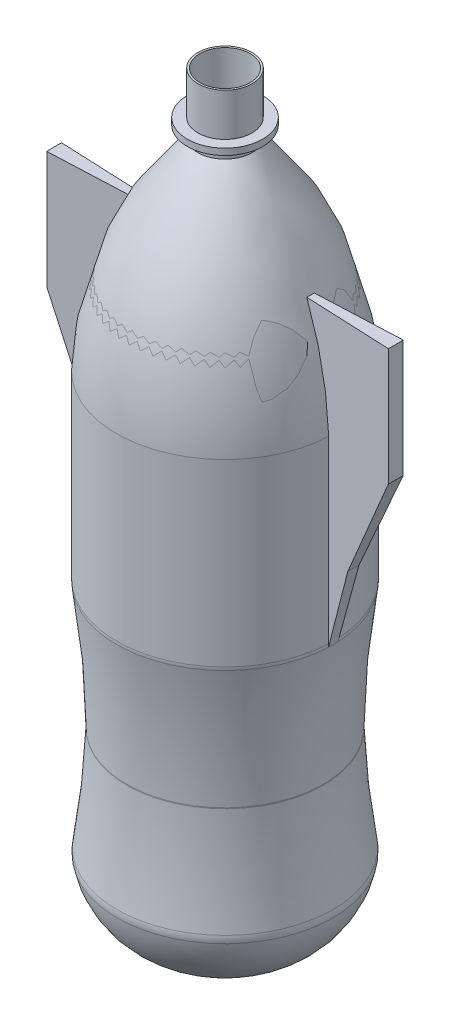
ISO-10303-21;
HEADER;
FILE_DESCRIPTION(('STEP AP214'),'2;1');
FILE_NAME('part.step','',(''),(''),'','','');
FILE_SCHEMA(('AUTOMOTIVE_DESIGN { 1 0 10303 214 1 1 1 1 }'));
ENDSEC;
DATA;
#1=APPLICATION_CONTEXT('core data for automotive mechanical design processes');
#2=APPLICATION_PROTOCOL_DEFINITION('international standard','automotive_design',2000,#1);
#3=PRODUCT_CONTEXT('',#1,'mechanical');
#4=PRODUCT('Part','Part','',(#3));
#5=PRODUCT_RELATED_PRODUCT_CATEGORY('part','',(#4));
#6=PRODUCT_DEFINITION_FORMATION('','',#4);
#7=PRODUCT_DEFINITION_CONTEXT('part definition',#1,'design');
#8=PRODUCT_DEFINITION('design','',#6,#7);
#9=PRODUCT_DEFINITION_SHAPE('','',#8);
#10=(LENGTH_UNIT() NAMED_UNIT(*) SI_UNIT(.MILLI.,.METRE.));
#11=(NAMED_UNIT(*) PLANE_ANGLE_UNIT() SI_UNIT($,.RADIAN.));
#12=(NAMED_UNIT(*) SI_UNIT($,.STERADIAN.) SOLID_ANGLE_UNIT());
#13=UNCERTAINTY_MEASURE_WITH_UNIT(LENGTH_MEASURE(1.E-05),#10,'distance_accuracy_value','');
#14=(GEOMETRIC_REPRESENTATION_CONTEXT(3) GLOBAL_UNCERTAINTY_ASSIGNED_CONTEXT((#13)) GLOBAL_UNIT_ASSIGNED_CONTEXT((#10,
#11,#12)) REPRESENTATION_CONTEXT('',''));
#15=CARTESIAN_POINT('',(0.,0.,0.));
#16=DIRECTION('',(0.,0.,1.));
#17=DIRECTION('',(1.,0.,0.));
#18=AXIS2_PLACEMENT_3D('',#15,#16,#17);
#19=CARTESIAN_POINT('',(0.,0.,0.));
#20=DIRECTION('',(0.,-1.,0.));
#21=DIRECTION('',(0.,0.,-1.));
#22=AXIS2_PLACEMENT_3D('',#19,#20,#21);
#23=CYLINDRICAL_SURFACE('',#22,50.9);
#24=CARTESIAN_POINT('',(0.,140.772436729844,0.));
#25=DIRECTION('',(0.,-1.,0.));
#26=DIRECTION('',(0.,0.,-1.));
#27=AXIS2_PLACEMENT_3D('',#24,#25,#26);
#28=CIRCLE('',#27,50.9);
#29=CARTESIAN_POINT('',(-50.8515544785166,140.772436729844,-2.22022681689561));
#30=VERTEX_POINT('',#29);
#31=CARTESIAN_POINT('',(50.8515544785166,140.772436729844,-2.22022681689561));
#32=VERTEX_POINT('',#31);
#33=EDGE_CURVE('E239',#30,#32,#28,.T.);
#34=ORIENTED_EDGE('',*,*,#33,.F.);
#35=DIRECTION('',(0.,-1.,0.));
#36=VECTOR('',#35,1.);
#37=CARTESIAN_POINT('',(-50.8515544785166,0.,-2.22022681689561));
#38=LINE('',#37,#36);
#39=CARTESIAN_POINT('',(-50.8515544785166,225.,-2.22022681689561));
#40=VERTEX_POINT('',#39);
#41=EDGE_CURVE('E234',#30,#40,#38,.F.);
#42=ORIENTED_EDGE('',*,*,#41,.T.);
#43=CARTESIAN_POINT('',(0.,225.,0.));
#44=DIRECTION('',(0.,-1.,0.));
#45=DIRECTION('',(0.,0.,-1.));
#46=AXIS2_PLACEMENT_3D('',#43,#44,#45);
#47=CIRCLE('',#46,50.9);
#48=CARTESIAN_POINT('',(50.8515544785166,225.,-2.22022681689561));
#49=VERTEX_POINT('',#48);
#50=EDGE_CURVE('E329',#40,#49,#47,.T.);
#51=ORIENTED_EDGE('',*,*,#50,.T.);
#52=DIRECTION('',(0.,-1.,0.));
#53=VECTOR('',#52,1.);
#54=CARTESIAN_POINT('',(50.8515544785166,0.,-2.22022681689561));
#55=LINE('',#54,#53);
#56=EDGE_CURVE('E231',#49,#32,#55,.T.);
#57=ORIENTED_EDGE('',*,*,#56,.T.);
#58=EDGE_LOOP('',(#34,#42,#51,#57));
#59=FACE_BOUND('',#58,.T.);
#60=ADVANCED_FACE('F41',(#59),#23,.T.);
#61=DIRECTION('',(0.,-1.,0.));
#62=VECTOR('',#61,1.);
#63=CARTESIAN_POINT('',(-50.8515544785166,0.,2.22022681689561));
#64=LINE('',#63,#62);
#65=CARTESIAN_POINT('',(-50.8515544785166,140.772436729844,2.22022681689561));
#66=VERTEX_POINT('',#65);
#67=CARTESIAN_POINT('',(-50.8515544785166,225.,2.22022681689561));
#68=VERTEX_POINT('',#67);
#69=EDGE_CURVE('E236',#66,#68,#64,.F.);
#70=ORIENTED_EDGE('',*,*,#69,.F.);
#71=CARTESIAN_POINT('',(50.8515544785166,140.772436729844,2.22022681689561));
#72=VERTEX_POINT('',#71);
#73=EDGE_CURVE('E242',#72,#66,#28,.T.);
#74=ORIENTED_EDGE('',*,*,#73,.F.);
#75=DIRECTION('',(0.,-1.,0.));
#76=VECTOR('',#75,1.);
#77=CARTESIAN_POINT('',(50.8515544785166,0.,2.22022681689561));
#78=LINE('',#77,#76);
#79=CARTESIAN_POINT('',(50.8515544785166,225.,2.22022681689561));
#80=VERTEX_POINT('',#79);
#81=EDGE_CURVE('E192',#80,#72,#78,.T.);
#82=ORIENTED_EDGE('',*,*,#81,.F.);
#83=EDGE_CURVE('E332',#80,#68,#47,.T.);
#84=ORIENTED_EDGE('',*,*,#83,.T.);
#85=EDGE_LOOP('',(#70,#74,#82,#84));
#86=FACE_BOUND('',#85,.T.);
#87=ADVANCED_FACE('F357',(#86),#23,.T.);
#88=CARTESIAN_POINT('',(0.,219.899303192665,0.));
#89=DIRECTION('',(0.,-1.,0.));
#90=DIRECTION('',(0.,0.,-1.));
#91=AXIS2_PLACEMENT_3D('',#88,#89,#90);
#92=DEGENERATE_TOROIDAL_SURFACE('',#91,99.0132512224308,150.,.F.);
#93=CARTESIAN_POINT('',(98.9190125468098,219.899303192664,-4.31889735937266));
#94=DIRECTION('',(0.0436193873653361,0.,0.999048221581858));
#95=DIRECTION('',(0.999048221581858,0.,-0.0436193873653361));
#96=AXIS2_PLACEMENT_3D('',#93,#94,#95);
#97=CIRCLE('',#96,150.000000000003);
#98=CARTESIAN_POINT('',(-40.1187717890936,275.8603906072,1.75162340464324));
#99=VERTEX_POINT('',#98);
#100=EDGE_CURVE('E175',#68,#99,#97,.F.);
#101=ORIENTED_EDGE('',*,*,#100,.F.);
#102=ORIENTED_EDGE('',*,*,#83,.F.);
#103=CARTESIAN_POINT('',(-98.9190125468098,219.899303192664,-4.31889735937266));
#104=DIRECTION('',(-0.0436193873653361,0.,0.999048221581858));
#105=DIRECTION('',(0.999048221581858,0.,0.0436193873653361));
#106=AXIS2_PLACEMENT_3D('',#103,#104,#105);
#107=CIRCLE('',#106,150.000000000003);
#108=CARTESIAN_POINT('',(40.1187717890936,275.8603906072,1.75162340464324));
#109=VERTEX_POINT('',#108);
#110=EDGE_CURVE('E193',#80,#109,#107,.T.);
#111=ORIENTED_EDGE('',*,*,#110,.T.);
#112=CARTESIAN_POINT('',(0.,275.8603906072,0.));
#113=DIRECTION('',(0.,-1.,0.));
#114=DIRECTION('',(0.,0.,-1.));
#115=AXIS2_PLACEMENT_3D('',#112,#113,#114);
#116=CIRCLE('',#115,40.1569923477477);
#117=CARTESIAN_POINT('',(40.1187717890936,275.8603906072,-1.75162340464324));
#118=VERTEX_POINT('',#117);
#119=EDGE_CURVE('E222',#118,#109,#116,.T.);
#120=ORIENTED_EDGE('',*,*,#119,.F.);
#121=CARTESIAN_POINT('',(-98.9190125468098,219.899303192664,4.31889735937266));
#122=DIRECTION('',(0.0436193873653361,0.,0.999048221581858));
#123=DIRECTION('',(0.999048221581858,0.,-0.0436193873653361));
#124=AXIS2_PLACEMENT_3D('',#121,#122,#123);
#125=CIRCLE('',#124,150.000000000003);
#126=EDGE_CURVE('E208',#49,#118,#125,.T.);
#127=ORIENTED_EDGE('',*,*,#126,.F.);
#128=ORIENTED_EDGE('',*,*,#50,.F.);
#129=CARTESIAN_POINT('',(98.9190125468098,219.899303192664,4.31889735937266));
#130=DIRECTION('',(-0.0436193873653361,0.,0.999048221581858));
#131=DIRECTION('',(0.999048221581858,0.,0.0436193873653361));
#132=AXIS2_PLACEMENT_3D('',#129,#130,#131);
#133=CIRCLE('',#132,150.000000000003);
#134=CARTESIAN_POINT('',(-40.1187717890936,275.8603906072,-1.75162340464324));
#135=VERTEX_POINT('',#134);
#136=EDGE_CURVE('E60',#40,#135,#133,.F.);
#137=ORIENTED_EDGE('',*,*,#136,.T.);
#138=CARTESIAN_POINT('',(0.,275.8603906072,0.));
#139=DIRECTION('',(0.,-1.,0.));
#140=DIRECTION('',(0.,0.,-1.));
#141=AXIS2_PLACEMENT_3D('',#138,#139,#140);
#142=CIRCLE('',#141,40.1569923477477);
#143=EDGE_CURVE('E55',#99,#135,#142,.T.);
#144=ORIENTED_EDGE('',*,*,#143,.F.);
#145=EDGE_LOOP('',(#101,#102,#111,#120,#127,#128,#137,#144));
#146=FACE_BOUND('',#145,.T.);
#147=CARTESIAN_POINT('',(0.,320.,0.));
#148=DIRECTION('',(0.,-1.,0.));
#149=DIRECTION('',(0.,0.,-1.));
#150=AXIS2_PLACEMENT_3D('',#147,#148,#149);
#151=CIRCLE('',#150,12.7);
#152=CARTESIAN_POINT('',(0.,320.,-12.7));
#153=VERTEX_POINT('',#152);
#154=EDGE_CURVE('E326',#153,#153,#151,.T.);
#155=ORIENTED_EDGE('',*,*,#154,.T.);
#156=EDGE_LOOP('',(#155));
#157=FACE_BOUND('',#156,.T.);
#158=ADVANCED_FACE('F353',(#146,#157),#92,.F.);
#159=CARTESIAN_POINT('',(0.,140.772436729844,0.));
#160=DIRECTION('',(0.,-1.,0.));
#161=DIRECTION('',(0.,0.,-1.));
#162=AXIS2_PLACEMENT_3D('',#159,#160,#161);
#163=TOROIDAL_SURFACE('',#162,40.9,9.99999999999999);
#164=CARTESIAN_POINT('',(-40.861072262698,140.772436729844,-1.78403294324225));
#165=DIRECTION('',(-0.0436193873653361,0.,0.999048221581858));
#166=DIRECTION('',(0.999048221581858,0.,0.0436193873653361));
#167=AXIS2_PLACEMENT_3D('',#164,#165,#166);
#168=CIRCLE('',#167,9.99999999999999);
#169=CARTESIAN_POINT('',(-50.7344932053478,139.24609258448,-2.21511581133099));
#170=VERTEX_POINT('',#169);
#171=EDGE_CURVE('E48',#30,#170,#168,.T.);
#172=ORIENTED_EDGE('',*,*,#171,.F.);
#173=ORIENTED_EDGE('',*,*,#33,.T.);
#174=CARTESIAN_POINT('',(40.861072262698,140.772436729844,-1.78403294324225));
#175=DIRECTION('',(0.0436193873653361,0.,0.999048221581858));
#176=DIRECTION('',(0.999048221581858,0.,-0.0436193873653361));
#177=AXIS2_PLACEMENT_3D('',#174,#175,#176);
#178=CIRCLE('',#177,9.99999999999999);
#179=CARTESIAN_POINT('',(50.7344932053478,139.24609258448,-2.21511581133099));
#180=VERTEX_POINT('',#179);
#181=EDGE_CURVE('E336',#180,#32,#178,.T.);
#182=ORIENTED_EDGE('',*,*,#181,.F.);
#183=CARTESIAN_POINT('',(0.,139.24609258448,0.));
#184=DIRECTION('',(0.,-1.,0.));
#185=DIRECTION('',(0.,0.,-1.));
#186=AXIS2_PLACEMENT_3D('',#183,#184,#185);
#187=CIRCLE('',#186,50.7828272042931);
#188=EDGE_CURVE('E248',#170,#180,#187,.T.);
#189=ORIENTED_EDGE('',*,*,#188,.F.);
#190=EDGE_LOOP('',(#172,#173,#182,#189));
#191=FACE_BOUND('',#190,.T.);
#192=ADVANCED_FACE('F379',(#191),#163,.T.);
#193=ORIENTED_EDGE('',*,*,#73,.T.);
#194=CARTESIAN_POINT('',(-40.861072262698,140.772436729844,1.78403294324225));
#195=DIRECTION('',(0.0436193873653361,0.,0.999048221581858));
#196=DIRECTION('',(0.999048221581858,0.,-0.0436193873653361));
#197=AXIS2_PLACEMENT_3D('',#194,#195,#196);
#198=CIRCLE('',#197,9.99999999999999);
#199=CARTESIAN_POINT('',(-50.7344932053477,139.24609258448,2.21511581133098));
#200=VERTEX_POINT('',#199);
#201=EDGE_CURVE('E11',#66,#200,#198,.T.);
#202=ORIENTED_EDGE('',*,*,#201,.T.);
#203=CARTESIAN_POINT('',(50.7344932053478,139.24609258448,2.21511581133099));
#204=VERTEX_POINT('',#203);
#205=EDGE_CURVE('E247',#204,#200,#187,.T.);
#206=ORIENTED_EDGE('',*,*,#205,.F.);
#207=CARTESIAN_POINT('',(40.861072262698,140.772436729844,1.78403294324225));
#208=DIRECTION('',(-0.0436193873653361,0.,0.999048221581858));
#209=DIRECTION('',(0.999048221581858,0.,0.0436193873653361));
#210=AXIS2_PLACEMENT_3D('',#207,#208,#209);
#211=CIRCLE('',#210,9.99999999999999);
#212=EDGE_CURVE('E333',#204,#72,#211,.T.);
#213=ORIENTED_EDGE('',*,*,#212,.T.);
#214=EDGE_LOOP('',(#193,#202,#206,#213));
#215=FACE_BOUND('',#214,.T.);
#216=ADVANCED_FACE('F366',(#215),#163,.T.);
#217=CARTESIAN_POINT('',(0.,0.,0.));
#218=DIRECTION('',(0.,-1.,0.));
#219=DIRECTION('',(0.,0.,-1.));
#220=AXIS2_PLACEMENT_3D('',#217,#218,#219);
#221=CYLINDRICAL_SURFACE('',#220,12.7);
#222=CARTESIAN_POINT('',(0.,325.,0.));
#223=DIRECTION('',(0.,-1.,0.));
#224=DIRECTION('',(0.,0.,-1.));
#225=AXIS2_PLACEMENT_3D('',#222,#223,#224);
#226=CIRCLE('',#225,12.7);
#227=CARTESIAN_POINT('',(0.,325.,-12.7));
#228=VERTEX_POINT('',#227);
#229=EDGE_CURVE('E323',#228,#228,#226,.T.);
#230=ORIENTED_EDGE('',*,*,#229,.T.);
#231=EDGE_LOOP('',(#230));
#232=FACE_BOUND('',#231,.T.);
#233=ORIENTED_EDGE('',*,*,#154,.F.);
#234=EDGE_LOOP('',(#233));
#235=FACE_BOUND('',#234,.T.);
#236=ADVANCED_FACE('F414',(#232,#235),#221,.T.);
#237=CARTESIAN_POINT('',(12.7,325.,0.));
#238=DIRECTION('',(0.,-1.,0.));
#239=DIRECTION('',(0.,0.,-1.));
#240=AXIS2_PLACEMENT_3D('',#237,#238,#239);
#241=PLANE('',#240);
#242=CARTESIAN_POINT('',(0.,325.,0.));
#243=DIRECTION('',(0.,-1.,0.));
#244=DIRECTION('',(0.,0.,-1.));
#245=AXIS2_PLACEMENT_3D('',#242,#243,#244);
#246=CIRCLE('',#245,17.7);
#247=CARTESIAN_POINT('',(0.,325.,-17.7));
#248=VERTEX_POINT('',#247);
#249=EDGE_CURVE('E320',#248,#248,#246,.T.);
#250=ORIENTED_EDGE('',*,*,#249,.T.);
#251=EDGE_LOOP('',(#250));
#252=FACE_BOUND('',#251,.T.);
#253=ORIENTED_EDGE('',*,*,#229,.F.);
#254=EDGE_LOOP('',(#253));
#255=FACE_BOUND('',#254,.T.);
#256=ADVANCED_FACE('F417',(#252,#255),#241,.T.);
#257=CARTESIAN_POINT('',(0.,0.,0.));
#258=DIRECTION('',(0.,-1.,0.));
#259=DIRECTION('',(0.,0.,-1.));
#260=AXIS2_PLACEMENT_3D('',#257,#258,#259);
#261=CYLINDRICAL_SURFACE('',#260,17.7);
#262=CARTESIAN_POINT('',(0.,328.,0.));
#263=DIRECTION('',(0.,-1.,0.));
#264=DIRECTION('',(0.,0.,-1.));
#265=AXIS2_PLACEMENT_3D('',#262,#263,#264);
#266=CIRCLE('',#265,17.7);
#267=CARTESIAN_POINT('',(0.,328.,-17.7));
#268=VERTEX_POINT('',#267);
#269=EDGE_CURVE('E317',#268,#268,#266,.T.);
#270=ORIENTED_EDGE('',*,*,#269,.T.);
#271=EDGE_LOOP('',(#270));
#272=FACE_BOUND('',#271,.T.);
#273=ORIENTED_EDGE('',*,*,#249,.F.);
#274=EDGE_LOOP('',(#273));
#275=FACE_BOUND('',#274,.T.);
#276=ADVANCED_FACE('F421',(#272,#275),#261,.T.);
#277=CARTESIAN_POINT('',(17.7,328.,0.));
#278=DIRECTION('',(0.,1.,0.));
#279=DIRECTION('',(0.,0.,1.));
#280=AXIS2_PLACEMENT_3D('',#277,#278,#279);
#281=PLANE('',#280);
#282=CARTESIAN_POINT('',(0.,328.,0.));
#283=DIRECTION('',(0.,-1.,0.));
#284=DIRECTION('',(0.,0.,-1.));
#285=AXIS2_PLACEMENT_3D('',#282,#283,#284);
#286=CIRCLE('',#285,12.7);
#287=CARTESIAN_POINT('',(0.,328.,-12.7));
#288=VERTEX_POINT('',#287);
#289=EDGE_CURVE('E314',#288,#288,#286,.T.);
#290=ORIENTED_EDGE('',*,*,#289,.T.);
#291=EDGE_LOOP('',(#290));
#292=FACE_BOUND('',#291,.T.);
#293=ORIENTED_EDGE('',*,*,#269,.F.);
#294=EDGE_LOOP('',(#293));
#295=FACE_BOUND('',#294,.T.);
#296=ADVANCED_FACE('F425',(#292,#295),#281,.T.);
#297=CARTESIAN_POINT('',(0.,0.,0.));
#298=DIRECTION('',(0.,-1.,0.));
#299=DIRECTION('',(0.,0.,-1.));
#300=AXIS2_PLACEMENT_3D('',#297,#298,#299);
#301=CYLINDRICAL_SURFACE('',#300,12.7);
#302=CARTESIAN_POINT('',(0.,348.,0.));
#303=DIRECTION('',(0.,-1.,0.));
#304=DIRECTION('',(0.,0.,-1.));
#305=AXIS2_PLACEMENT_3D('',#302,#303,#304);
#306=CIRCLE('',#305,12.7);
#307=CARTESIAN_POINT('',(0.,348.,-12.7));
#308=VERTEX_POINT('',#307);
#309=EDGE_CURVE('E311',#308,#308,#306,.T.);
#310=ORIENTED_EDGE('',*,*,#309,.T.);
#311=EDGE_LOOP('',(#310));
#312=FACE_BOUND('',#311,.T.);
#313=ORIENTED_EDGE('',*,*,#289,.F.);
#314=EDGE_LOOP('',(#313));
#315=FACE_BOUND('',#314,.T.);
#316=ADVANCED_FACE('F429',(#312,#315),#301,.T.);
#317=CARTESIAN_POINT('',(11.8,348.,0.));
#318=DIRECTION('',(0.,-1.,0.));
#319=DIRECTION('',(0.,0.,-1.));
#320=AXIS2_PLACEMENT_3D('',#317,#318,#319);
#321=PLANE('',#320);
#322=ORIENTED_EDGE('',*,*,#309,.F.);
#323=EDGE_LOOP('',(#322));
#324=FACE_BOUND('',#323,.T.);
#325=CARTESIAN_POINT('',(0.,348.,0.));
#326=DIRECTION('',(0.,-1.,0.));
#327=DIRECTION('',(0.,0.,-1.));
#328=AXIS2_PLACEMENT_3D('',#325,#326,#327);
#329=CIRCLE('',#328,11.8);
#330=CARTESIAN_POINT('',(0.,348.,-11.8));
#331=VERTEX_POINT('',#330);
#332=EDGE_CURVE('E308',#331,#331,#329,.T.);
#333=ORIENTED_EDGE('',*,*,#332,.T.);
#334=EDGE_LOOP('',(#333));
#335=FACE_BOUND('',#334,.T.);
#336=ADVANCED_FACE('F433',(#324,#335),#321,.F.);
#337=CARTESIAN_POINT('',(0.,0.,0.));
#338=DIRECTION('',(0.,-1.,0.));
#339=DIRECTION('',(0.,0.,-1.));
#340=AXIS2_PLACEMENT_3D('',#337,#338,#339);
#341=CYLINDRICAL_SURFACE('',#340,11.8);
#342=ORIENTED_EDGE('',*,*,#332,.F.);
#343=EDGE_LOOP('',(#342));
#344=FACE_BOUND('',#343,.T.);
#345=CARTESIAN_POINT('',(0.,327.1,0.));
#346=DIRECTION('',(0.,-1.,0.));
#347=DIRECTION('',(0.,0.,-1.));
#348=AXIS2_PLACEMENT_3D('',#345,#346,#347);
#349=CIRCLE('',#348,11.8);
#350=CARTESIAN_POINT('',(0.,327.1,-11.8));
#351=VERTEX_POINT('',#350);
#352=EDGE_CURVE('E305',#351,#351,#349,.T.);
#353=ORIENTED_EDGE('',*,*,#352,.T.);
#354=EDGE_LOOP('',(#353));
#355=FACE_BOUND('',#354,.T.);
#356=ADVANCED_FACE('F437',(#344,#355),#341,.F.);
#357=CARTESIAN_POINT('',(16.8,327.1,0.));
#358=DIRECTION('',(0.,1.,0.));
#359=DIRECTION('',(0.,0.,1.));
#360=AXIS2_PLACEMENT_3D('',#357,#358,#359);
#361=PLANE('',#360);
#362=ORIENTED_EDGE('',*,*,#352,.F.);
#363=EDGE_LOOP('',(#362));
#364=FACE_BOUND('',#363,.T.);
#365=CARTESIAN_POINT('',(0.,327.1,0.));
#366=DIRECTION('',(0.,-1.,0.));
#367=DIRECTION('',(0.,0.,-1.));
#368=AXIS2_PLACEMENT_3D('',#365,#366,#367);
#369=CIRCLE('',#368,16.8);
#370=CARTESIAN_POINT('',(0.,327.1,-16.8));
#371=VERTEX_POINT('',#370);
#372=EDGE_CURVE('E302',#371,#371,#369,.T.);
#373=ORIENTED_EDGE('',*,*,#372,.T.);
#374=EDGE_LOOP('',(#373));
#375=FACE_BOUND('',#374,.T.);
#376=ADVANCED_FACE('F441',(#364,#375),#361,.F.);
#377=CARTESIAN_POINT('',(0.,0.,0.));
#378=DIRECTION('',(0.,-1.,0.));
#379=DIRECTION('',(0.,0.,-1.));
#380=AXIS2_PLACEMENT_3D('',#377,#378,#379);
#381=CYLINDRICAL_SURFACE('',#380,16.8);
#382=ORIENTED_EDGE('',*,*,#372,.F.);
#383=EDGE_LOOP('',(#382));
#384=FACE_BOUND('',#383,.T.);
#385=CARTESIAN_POINT('',(0.,325.9,0.));
#386=DIRECTION('',(0.,-1.,0.));
#387=DIRECTION('',(0.,0.,-1.));
#388=AXIS2_PLACEMENT_3D('',#385,#386,#387);
#389=CIRCLE('',#388,16.8);
#390=CARTESIAN_POINT('',(0.,325.9,-16.8));
#391=VERTEX_POINT('',#390);
#392=EDGE_CURVE('E299',#391,#391,#389,.T.);
#393=ORIENTED_EDGE('',*,*,#392,.T.);
#394=EDGE_LOOP('',(#393));
#395=FACE_BOUND('',#394,.T.);
#396=ADVANCED_FACE('F445',(#384,#395),#381,.F.);
#397=CARTESIAN_POINT('',(11.8,325.9,0.));
#398=DIRECTION('',(0.,-1.,0.));
#399=DIRECTION('',(0.,0.,-1.));
#400=AXIS2_PLACEMENT_3D('',#397,#398,#399);
#401=PLANE('',#400);
#402=ORIENTED_EDGE('',*,*,#392,.F.);
#403=EDGE_LOOP('',(#402));
#404=FACE_BOUND('',#403,.T.);
#405=CARTESIAN_POINT('',(0.,325.9,0.));
#406=DIRECTION('',(0.,-1.,0.));
#407=DIRECTION('',(0.,0.,-1.));
#408=AXIS2_PLACEMENT_3D('',#405,#406,#407);
#409=CIRCLE('',#408,11.8);
#410=CARTESIAN_POINT('',(0.,325.9,-11.8));
#411=VERTEX_POINT('',#410);
#412=EDGE_CURVE('E296',#411,#411,#409,.T.);
#413=ORIENTED_EDGE('',*,*,#412,.T.);
#414=EDGE_LOOP('',(#413));
#415=FACE_BOUND('',#414,.T.);
#416=ADVANCED_FACE('F449',(#404,#415),#401,.F.);
#417=CARTESIAN_POINT('',(0.,0.,0.));
#418=DIRECTION('',(0.,-1.,0.));
#419=DIRECTION('',(0.,0.,-1.));
#420=AXIS2_PLACEMENT_3D('',#417,#418,#419);
#421=CYLINDRICAL_SURFACE('',#420,11.8);
#422=ORIENTED_EDGE('',*,*,#412,.F.);
#423=EDGE_LOOP('',(#422));
#424=FACE_BOUND('',#423,.T.);
#425=CARTESIAN_POINT('',(0.,319.655171959943,0.));
#426=DIRECTION('',(0.,-1.,0.));
#427=DIRECTION('',(0.,0.,-1.));
#428=AXIS2_PLACEMENT_3D('',#425,#426,#427);
#429=CIRCLE('',#428,11.8);
#430=CARTESIAN_POINT('',(0.,319.655171959943,-11.8));
#431=VERTEX_POINT('',#430);
#432=EDGE_CURVE('E293',#431,#431,#429,.T.);
#433=ORIENTED_EDGE('',*,*,#432,.T.);
#434=EDGE_LOOP('',(#433));
#435=FACE_BOUND('',#434,.T.);
#436=ADVANCED_FACE('F453',(#424,#435),#421,.F.);
#437=CARTESIAN_POINT('',(0.,219.899303192665,0.));
#438=DIRECTION('',(0.,-1.,0.));
#439=DIRECTION('',(0.,0.,-1.));
#440=AXIS2_PLACEMENT_3D('',#437,#438,#439);
#441=DEGENERATE_TOROIDAL_SURFACE('',#440,99.0132512224308,149.1,.F.);
#442=ORIENTED_EDGE('',*,*,#432,.F.);
#443=EDGE_LOOP('',(#442));
#444=FACE_BOUND('',#443,.T.);
#445=CARTESIAN_POINT('',(0.,224.984670447911,0.));
#446=DIRECTION('',(0.,-1.,0.));
#447=DIRECTION('',(0.,0.,-1.));
#448=AXIS2_PLACEMENT_3D('',#445,#446,#447);
#449=CIRCLE('',#448,50.);
#450=CARTESIAN_POINT('',(0.,224.984670447911,-50.));
#451=VERTEX_POINT('',#450);
#452=EDGE_CURVE('E290',#451,#451,#449,.T.);
#453=ORIENTED_EDGE('',*,*,#452,.T.);
#454=EDGE_LOOP('',(#453));
#455=FACE_BOUND('',#454,.T.);
#456=ADVANCED_FACE('F457',(#444,#455),#441,.T.);
#457=CARTESIAN_POINT('',(0.,0.,0.));
#458=DIRECTION('',(0.,-1.,0.));
#459=DIRECTION('',(0.,0.,-1.));
#460=AXIS2_PLACEMENT_3D('',#457,#458,#459);
#461=CYLINDRICAL_SURFACE('',#460,50.);
#462=ORIENTED_EDGE('',*,*,#452,.F.);
#463=EDGE_LOOP('',(#462));
#464=FACE_BOUND('',#463,.T.);
#465=CARTESIAN_POINT('',(0.,140.772436729844,0.));
#466=DIRECTION('',(0.,-1.,0.));
#467=DIRECTION('',(0.,0.,-1.));
#468=AXIS2_PLACEMENT_3D('',#465,#466,#467);
#469=CIRCLE('',#468,50.);
#470=CARTESIAN_POINT('',(0.,140.772436729844,-50.));
#471=VERTEX_POINT('',#470);
#472=EDGE_CURVE('E287',#471,#471,#469,.T.);
#473=ORIENTED_EDGE('',*,*,#472,.T.);
#474=EDGE_LOOP('',(#473));
#475=FACE_BOUND('',#474,.T.);
#476=ADVANCED_FACE('F461',(#464,#475),#461,.F.);
#477=CARTESIAN_POINT('',(0.,140.772436729844,0.));
#478=DIRECTION('',(0.,-1.,0.));
#479=DIRECTION('',(0.,0.,-1.));
#480=AXIS2_PLACEMENT_3D('',#477,#478,#479);
#481=TOROIDAL_SURFACE('',#480,40.9,9.10000000000003);
#482=CARTESIAN_POINT('',(0.,139.383463557562,0.));
#483=DIRECTION('',(0.,-1.,0.));
#484=DIRECTION('',(0.,0.,-1.));
#485=AXIS2_PLACEMENT_3D('',#482,#483,#484);
#486=CIRCLE('',#485,49.8933727559066);
#487=CARTESIAN_POINT('',(0.,139.383463557562,-49.8933727559066));
#488=VERTEX_POINT('',#487);
#489=EDGE_CURVE('E284',#488,#488,#486,.T.);
#490=ORIENTED_EDGE('',*,*,#489,.T.);
#491=EDGE_LOOP('',(#490));
#492=FACE_BOUND('',#491,.T.);
#493=ORIENTED_EDGE('',*,*,#472,.F.);
#494=EDGE_LOOP('',(#493));
#495=FACE_BOUND('',#494,.T.);
#496=ADVANCED_FACE('F465',(#492,#495),#481,.F.);
#497=CARTESIAN_POINT('',(0.,78.1923267699191,0.));
#498=DIRECTION('',(0.,-1.,0.));
#499=DIRECTION('',(0.,0.,-1.));
#500=AXIS2_PLACEMENT_3D('',#497,#498,#499);
#501=TOROIDAL_SURFACE('',#500,446.095915376011,400.9);
#502=ORIENTED_EDGE('',*,*,#489,.F.);
#503=EDGE_LOOP('',(#502));
#504=FACE_BOUND('',#503,.T.);
#505=CARTESIAN_POINT('',(0.,80.196300583634,0.));
#506=DIRECTION('',(0.,-1.,0.));
#507=DIRECTION('',(0.,0.,-1.));
#508=AXIS2_PLACEMENT_3D('',#505,#506,#507);
#509=CIRCLE('',#508,45.2009240267131);
#510=CARTESIAN_POINT('',(0.,80.196300583634,-45.2009240267131));
#511=VERTEX_POINT('',#510);
#512=EDGE_CURVE('E281',#511,#511,#509,.T.);
#513=ORIENTED_EDGE('',*,*,#512,.T.);
#514=EDGE_LOOP('',(#513));
#515=FACE_BOUND('',#514,.T.);
#516=ADVANCED_FACE('F469',(#504,#515),#501,.T.);
#517=CARTESIAN_POINT('',(0.,80.1418148900209,0.));
#518=DIRECTION('',(0.,-1.,0.));
#519=DIRECTION('',(0.,0.,-1.));
#520=AXIS2_PLACEMENT_3D('',#517,#518,#519);
#521=TOROIDAL_SURFACE('',#520,56.100787847385,10.9000000000001);
#522=ORIENTED_EDGE('',*,*,#512,.F.);
#523=EDGE_LOOP('',(#522));
#524=FACE_BOUND('',#523,.T.);
#525=CARTESIAN_POINT('',(0.,79.7782850090078,0.));
#526=DIRECTION('',(0.,-1.,0.));
#527=DIRECTION('',(0.,0.,-1.));
#528=AXIS2_PLACEMENT_3D('',#525,#526,#527);
#529=CIRCLE('',#528,45.2068516429816);
#530=CARTESIAN_POINT('',(0.,79.7782850090078,-45.2068516429816));
#531=VERTEX_POINT('',#530);
#532=EDGE_CURVE('E278',#531,#531,#529,.T.);
#533=ORIENTED_EDGE('',*,*,#532,.T.);
#534=EDGE_LOOP('',(#533));
#535=FACE_BOUND('',#534,.T.);
#536=ADVANCED_FACE('F473',(#524,#535),#521,.T.);
#537=CARTESIAN_POINT('',(0.,93.1488473299418,0.));
#538=DIRECTION('',(0.,-1.,0.));
#539=DIRECTION('',(0.,0.,-1.));
#540=AXIS2_PLACEMENT_3D('',#537,#538,#539);
#541=TOROIDAL_SURFACE('',#540,445.883826353561,400.9);
#542=ORIENTED_EDGE('',*,*,#532,.F.);
#543=EDGE_LOOP('',(#542));
#544=FACE_BOUND('',#543,.T.);
#545=CARTESIAN_POINT('',(0.,31.450313517538,0.));
#546=DIRECTION('',(0.,-1.,0.));
#547=DIRECTION('',(0.,0.,-1.));
#548=AXIS2_PLACEMENT_3D('',#545,#546,#547);
#549=CIRCLE('',#548,49.7599809145367);
#550=CARTESIAN_POINT('',(0.,31.450313517538,-49.7599809145367));
#551=VERTEX_POINT('',#550);
#552=EDGE_CURVE('E275',#551,#551,#549,.T.);
#553=ORIENTED_EDGE('',*,*,#552,.T.);
#554=EDGE_LOOP('',(#553));
#555=FACE_BOUND('',#554,.T.);
#556=ADVANCED_FACE('F477',(#544,#555),#541,.T.);
#557=CARTESIAN_POINT('',(0.,30.0498229770222,0.));
#558=DIRECTION('',(0.,-1.,0.));
#559=DIRECTION('',(0.,0.,-1.));
#560=AXIS2_PLACEMENT_3D('',#557,#558,#559);
#561=TOROIDAL_SURFACE('',#560,40.7683945002311,9.09999999999993);
#562=CARTESIAN_POINT('',(0.,28.3235204811364,0.));
#563=DIRECTION('',(0.,-1.,0.));
#564=DIRECTION('',(0.,0.,-1.));
#565=AXIS2_PLACEMENT_3D('',#562,#563,#564);
#566=CIRCLE('',#565,49.70315133479);
#567=CARTESIAN_POINT('',(0.,28.3235204811364,-49.70315133479));
#568=VERTEX_POINT('',#567);
#569=EDGE_CURVE('E272',#568,#568,#566,.T.);
#570=ORIENTED_EDGE('',*,*,#569,.T.);
#571=EDGE_LOOP('',(#570));
#572=FACE_BOUND('',#571,.T.);
#573=ORIENTED_EDGE('',*,*,#552,.F.);
#574=EDGE_LOOP('',(#573));
#575=FACE_BOUND('',#574,.T.);
#576=ADVANCED_FACE('F481',(#572,#575),#561,.F.);
#577=CARTESIAN_POINT('',(0.,35.910657112482,0.));
#578=DIRECTION('',(0.,-1.,0.));
#579=DIRECTION('',(0.,0.,-1.));
#580=AXIS2_PLACEMENT_3D('',#577,#578,#579);
#581=DEGENERATE_TOROIDAL_SURFACE('',#580,10.4347027093559,39.994695894719,.T.);
#582=ORIENTED_EDGE('',*,*,#569,.F.);
#583=EDGE_LOOP('',(#582));
#584=FACE_BOUND('',#583,.T.);
#585=CARTESIAN_POINT('',(0.,2.28615203180544,0.));
#586=DIRECTION('',(0.,-1.,0.));
#587=DIRECTION('',(0.,0.,-1.));
#588=AXIS2_PLACEMENT_3D('',#585,#586,#587);
#589=CIRCLE('',#588,32.0903799740043);
#590=CARTESIAN_POINT('',(0.,2.28615203180544,-32.0903799740043));
#591=VERTEX_POINT('',#590);
#592=EDGE_CURVE('E269',#591,#591,#589,.T.);
#593=ORIENTED_EDGE('',*,*,#592,.T.);
#594=EDGE_LOOP('',(#593));
#595=FACE_BOUND('',#594,.T.);
#596=ADVANCED_FACE('F485',(#584,#595),#581,.F.);
#597=CARTESIAN_POINT('',(0.,4.05167266122338,0.));
#598=DIRECTION('',(0.,-1.,0.));
#599=DIRECTION('',(0.,0.,-1.));
#600=AXIS2_PLACEMENT_3D('',#597,#598,#599);
#601=TOROIDAL_SURFACE('',#600,30.9533061386268,2.1);
#602=CARTESIAN_POINT('',(0.,2.83945730078106,0.));
#603=DIRECTION('',(0.,-1.,0.));
#604=DIRECTION('',(0.,0.,-1.));
#605=AXIS2_PLACEMENT_3D('',#602,#603,#604);
#606=CIRCLE('',#605,29.2385076315398);
#607=CARTESIAN_POINT('',(0.,2.83945730078106,-29.2385076315398));
#608=VERTEX_POINT('',#607);
#609=EDGE_CURVE('E266',#608,#608,#606,.T.);
#610=ORIENTED_EDGE('',*,*,#609,.T.);
#611=EDGE_LOOP('',(#610));
#612=FACE_BOUND('',#611,.T.);
#613=ORIENTED_EDGE('',*,*,#592,.F.);
#614=EDGE_LOOP('',(#613));
#615=FACE_BOUND('',#614,.T.);
#616=ADVANCED_FACE('F489',(#612,#615),#601,.F.);
#617=CARTESIAN_POINT('',(0.,-16.4405393843492,-1.96504566168043));
#618=DIRECTION('',(-1.,0.,0.));
#619=DIRECTION('',(0.,0.,-1.));
#620=AXIS2_PLACEMENT_3D('',#617,#618,#619);
#621=CIRCLE('',#620,33.4);
#622=TRIMMED_CURVE('',#621,(PARAMETER_VALUE(-1.62966402342501)),
(PARAMETER_VALUE(1.62966402342501)),.T.,.PARAMETER.);
#623=CARTESIAN_POINT('',(0.,-16.4405393843492,0.));
#624=DIRECTION('',(0.,-1.,0.));
#625=AXIS1_PLACEMENT('',#623,#624);
#626=SURFACE_OF_REVOLUTION('',#622,#625);
#627=CARTESIAN_POINT('',(0.,16.9016050509974,0.));
#628=VERTEX_POINT('',#627);
#629=VERTEX_LOOP('',#628);
#630=FACE_BOUND('',#629,.T.);
#631=ORIENTED_EDGE('',*,*,#609,.F.);
#632=EDGE_LOOP('',(#631));
#633=FACE_BOUND('',#632,.T.);
#634=ADVANCED_FACE('F493',(#630,#633),#626,.T.);
#635=CARTESIAN_POINT('',(0.,-16.4405393843492,-1.96504566168043));
#636=DIRECTION('',(-1.,0.,0.));
#637=DIRECTION('',(0.,0.,-1.));
#638=AXIS2_PLACEMENT_3D('',#635,#636,#637);
#639=CIRCLE('',#638,32.5);
#640=TRIMMED_CURVE('',#639,(PARAMETER_VALUE(-1.63129617071254)),
(PARAMETER_VALUE(1.63129617071254)),.T.,.PARAMETER.);
#641=CARTESIAN_POINT('',(0.,-16.4405393843492,0.));
#642=DIRECTION('',(0.,-1.,0.));
#643=AXIS1_PLACEMENT('',#641,#642);
#644=SURFACE_OF_REVOLUTION('',#640,#643);
#645=CARTESIAN_POINT('',(0.,16.,0.));
#646=VERTEX_POINT('',#645);
#647=VERTEX_LOOP('',#646);
#648=FACE_BOUND('',#647,.T.);
#649=CARTESIAN_POINT('',(0.,2.31993643202007,0.));
#650=DIRECTION('',(0.,-1.,0.));
#651=DIRECTION('',(0.,0.,-1.));
#652=AXIS2_PLACEMENT_3D('',#649,#650,#651);
#653=CIRCLE('',#652,28.5035939856454);
#654=CARTESIAN_POINT('',(0.,2.31993643202007,-28.5035939856454));
#655=VERTEX_POINT('',#654);
#656=EDGE_CURVE('E263',#655,#655,#653,.T.);
#657=ORIENTED_EDGE('',*,*,#656,.T.);
#658=EDGE_LOOP('',(#657));
#659=FACE_BOUND('',#658,.T.);
#660=ADVANCED_FACE('F497',(#648,#659),#644,.F.);
#661=CARTESIAN_POINT('',(0.,4.05167266122338,0.));
#662=DIRECTION('',(0.,-1.,0.));
#663=DIRECTION('',(0.,0.,-1.));
#664=AXIS2_PLACEMENT_3D('',#661,#662,#663);
#665=TOROIDAL_SURFACE('',#664,30.9533061386268,3.);
#666=ORIENTED_EDGE('',*,*,#656,.F.);
#667=EDGE_LOOP('',(#666));
#668=FACE_BOUND('',#667,.T.);
#669=CARTESIAN_POINT('',(0.,1.52950033348356,0.));
#670=DIRECTION('',(0.,-1.,0.));
#671=DIRECTION('',(0.,0.,-1.));
#672=AXIS2_PLACEMENT_3D('',#669,#670,#671);
#673=CIRCLE('',#672,32.5776973320231);
#674=CARTESIAN_POINT('',(0.,1.52950033348356,-32.5776973320231));
#675=VERTEX_POINT('',#674);
#676=EDGE_CURVE('E260',#675,#675,#673,.T.);
#677=ORIENTED_EDGE('',*,*,#676,.T.);
#678=EDGE_LOOP('',(#677));
#679=FACE_BOUND('',#678,.T.);
#680=ADVANCED_FACE('F501',(#668,#679),#665,.T.);
#681=CARTESIAN_POINT('',(0.,35.910657112482,0.));
#682=DIRECTION('',(0.,-1.,0.));
#683=DIRECTION('',(0.,0.,-1.));
#684=AXIS2_PLACEMENT_3D('',#681,#682,#683);
#685=DEGENERATE_TOROIDAL_SURFACE('',#684,10.4347027093559,40.8946958947191,.T.);
#686=CARTESIAN_POINT('',(0.,28.1527872672576,0.));
#687=DIRECTION('',(0.,-1.,0.));
#688=DIRECTION('',(0.,0.,-1.));
#689=AXIS2_PLACEMENT_3D('',#686,#687,#688);
#690=CIRCLE('',#689,50.5868086041419);
#691=CARTESIAN_POINT('',(0.,28.1527872672576,-50.5868086041419));
#692=VERTEX_POINT('',#691);
#693=EDGE_CURVE('E257',#692,#692,#690,.T.);
#694=ORIENTED_EDGE('',*,*,#693,.T.);
#695=EDGE_LOOP('',(#694));
#696=FACE_BOUND('',#695,.T.);
#697=ORIENTED_EDGE('',*,*,#676,.F.);
#698=EDGE_LOOP('',(#697));
#699=FACE_BOUND('',#698,.T.);
#700=ADVANCED_FACE('F505',(#696,#699),#685,.T.);
#701=CARTESIAN_POINT('',(0.,30.0498229770222,0.));
#702=DIRECTION('',(0.,-1.,0.));
#703=DIRECTION('',(0.,0.,-1.));
#704=AXIS2_PLACEMENT_3D('',#701,#702,#703);
#705=TOROIDAL_SURFACE('',#704,40.7683945002311,10.);
#706=ORIENTED_EDGE('',*,*,#693,.F.);
#707=EDGE_LOOP('',(#706));
#708=FACE_BOUND('',#707,.T.);
#709=CARTESIAN_POINT('',(0.,31.5888235709958,0.));
#710=DIRECTION('',(0.,-1.,0.));
#711=DIRECTION('',(0.,0.,-1.));
#712=AXIS2_PLACEMENT_3D('',#709,#710,#711);
#713=CIRCLE('',#712,50.6492586917757);
#714=CARTESIAN_POINT('',(0.,31.5888235709958,-50.6492586917757));
#715=VERTEX_POINT('',#714);
#716=EDGE_CURVE('E254',#715,#715,#713,.T.);
#717=ORIENTED_EDGE('',*,*,#716,.T.);
#718=EDGE_LOOP('',(#717));
#719=FACE_BOUND('',#718,.T.);
#720=ADVANCED_FACE('F509',(#708,#719),#705,.T.);
#721=CARTESIAN_POINT('',(0.,93.1488473299418,0.));
#722=DIRECTION('',(0.,-1.,0.));
#723=DIRECTION('',(0.,0.,-1.));
#724=AXIS2_PLACEMENT_3D('',#721,#722,#723);
#725=TOROIDAL_SURFACE('',#724,445.883826353561,400.);
#726=CARTESIAN_POINT('',(0.,79.8083012377152,0.));
#727=DIRECTION('',(0.,-1.,0.));
#728=DIRECTION('',(0.,0.,-1.));
#729=AXIS2_PLACEMENT_3D('',#726,#727,#728);
#730=CIRCLE('',#729,46.1063509626112);
#731=CARTESIAN_POINT('',(0.,79.8083012377152,-46.1063509626112));
#732=VERTEX_POINT('',#731);
#733=EDGE_CURVE('E251',#732,#732,#730,.T.);
#734=ORIENTED_EDGE('',*,*,#733,.T.);
#735=EDGE_LOOP('',(#734));
#736=FACE_BOUND('',#735,.T.);
#737=ORIENTED_EDGE('',*,*,#716,.F.);
#738=EDGE_LOOP('',(#737));
#739=FACE_BOUND('',#738,.T.);
#740=ADVANCED_FACE('F513',(#736,#739),#725,.F.);
#741=CARTESIAN_POINT('',(0.,80.1418148900209,0.));
#742=DIRECTION('',(0.,-1.,0.));
#743=DIRECTION('',(0.,0.,-1.));
#744=AXIS2_PLACEMENT_3D('',#741,#742,#743);
#745=TOROIDAL_SURFACE('',#744,56.100787847385,10.);
#746=CARTESIAN_POINT('',(0.,80.1918017648953,0.));
#747=DIRECTION('',(0.,-1.,0.));
#748=DIRECTION('',(0.,0.,-1.));
#749=AXIS2_PLACEMENT_3D('',#746,#747,#748);
#750=CIRCLE('',#749,46.1009127825485);
#751=CARTESIAN_POINT('',(0.,80.1918017648953,-46.1009127825485));
#752=VERTEX_POINT('',#751);
#753=EDGE_CURVE('E246',#752,#752,#750,.T.);
#754=ORIENTED_EDGE('',*,*,#753,.T.);
#755=EDGE_LOOP('',(#754));
#756=FACE_BOUND('',#755,.T.);
#757=ORIENTED_EDGE('',*,*,#733,.F.);
#758=EDGE_LOOP('',(#757));
#759=FACE_BOUND('',#758,.T.);
#760=ADVANCED_FACE('F517',(#756,#759),#745,.F.);
#761=CARTESIAN_POINT('',(0.,78.1923267699191,0.));
#762=DIRECTION('',(0.,-1.,0.));
#763=DIRECTION('',(0.,0.,-1.));
#764=AXIS2_PLACEMENT_3D('',#761,#762,#763);
#765=TOROIDAL_SURFACE('',#764,446.095915376011,400.);
#766=EDGE_CURVE('E243',#180,#204,#187,.T.);
#767=ORIENTED_EDGE('',*,*,#766,.T.);
#768=ORIENTED_EDGE('',*,*,#205,.T.);
#769=CARTESIAN_POINT('',(0.,139.24609258448,0.));
#770=DIRECTION('',(0.,-1.,0.));
#771=DIRECTION('',(0.,0.,-1.));
#772=AXIS2_PLACEMENT_3D('',#769,#770,#771);
#773=CIRCLE('',#772,50.7828272042931);
#774=EDGE_CURVE('E186',#200,#170,#773,.T.);
#775=ORIENTED_EDGE('',*,*,#774,.T.);
#776=ORIENTED_EDGE('',*,*,#188,.T.);
#777=EDGE_LOOP('',(#767,#768,#775,#776));
#778=FACE_BOUND('',#777,.T.);
#779=ORIENTED_EDGE('',*,*,#753,.F.);
#780=EDGE_LOOP('',(#779));
#781=FACE_BOUND('',#780,.T.);
#782=ADVANCED_FACE('F370',(#778,#781),#765,.F.);
#783=CARTESIAN_POINT('',(0.,0.,0.));
#784=DIRECTION('',(0.0436193873653361,0.,0.999048221581858));
#785=DIRECTION('',(0.999048221581858,0.,-0.0436193873653361));
#786=AXIS2_PLACEMENT_3D('',#783,#784,#785);
#787=PLANE('',#786);
#788=ORIENTED_EDGE('',*,*,#56,.F.);
#789=ORIENTED_EDGE('',*,*,#126,.T.);
#790=DIRECTION('',(0.999048221581858,0.,-0.0436193873653361));
#791=VECTOR('',#790,1.);
#792=CARTESIAN_POINT('',(0.,275.8603906072,0.));
#793=LINE('',#792,#791);
#794=CARTESIAN_POINT('',(80.0807006523679,275.8603906072,-3.49639889925669));
#795=VERTEX_POINT('',#794);
#796=EDGE_CURVE('E219',#118,#795,#793,.T.);
#797=ORIENTED_EDGE('',*,*,#796,.T.);
#798=DIRECTION('',(0.,-1.,0.));
#799=VECTOR('',#798,1.);
#800=CARTESIAN_POINT('',(80.080700652368,0.,-3.49639889925669));
#801=LINE('',#800,#799);
#802=CARTESIAN_POINT('',(80.0807006523679,220.8603906072,-3.49639889925669));
#803=VERTEX_POINT('',#802);
#804=EDGE_CURVE('E216',#795,#803,#801,.T.);
#805=ORIENTED_EDGE('',*,*,#804,.T.);
#806=DIRECTION('',(-0.397570580195727,-0.91740739203563,0.0173583064040297));
#807=VECTOR('',#806,1.);
#808=CARTESIAN_POINT('',(-13.1565090412409,5.71241526258884,0.574425590124941));
#809=LINE('',#808,#807);
#810=CARTESIAN_POINT('',(60.2021716425816,174.990021005418,-2.6284835790552));
#811=VERTEX_POINT('',#810);
#812=EDGE_CURVE('E213',#803,#811,#809,.T.);
#813=ORIENTED_EDGE('',*,*,#812,.T.);
#814=DIRECTION('',(-0.256029470694933,-0.966604340741032,0.011178488102908));
#815=VECTOR('',#814,1.);
#816=CARTESIAN_POINT('',(12.9419408909373,-3.43453326549907,-0.565057342364554));
#817=LINE('',#816,#815);
#818=EDGE_CURVE('E210',#811,#180,#817,.T.);
#819=ORIENTED_EDGE('',*,*,#818,.T.);
#820=ORIENTED_EDGE('',*,*,#181,.T.);
#821=EDGE_LOOP('',(#788,#789,#797,#805,#813,#819,#820));
#822=FACE_BOUND('',#821,.T.);
#823=ADVANCED_FACE('F377',(#822),#787,.F.);
#824=CARTESIAN_POINT('',(0.,0.,0.));
#825=DIRECTION('',(-0.0436193873653361,0.,0.999048221581858));
#826=DIRECTION('',(0.999048221581858,0.,0.0436193873653361));
#827=AXIS2_PLACEMENT_3D('',#824,#825,#826);
#828=PLANE('',#827);
#829=ORIENTED_EDGE('',*,*,#110,.F.);
#830=ORIENTED_EDGE('',*,*,#81,.T.);
#831=ORIENTED_EDGE('',*,*,#212,.F.);
#832=DIRECTION('',(-0.256029470694932,-0.966604340741032,-0.011178488102908));
#833=VECTOR('',#832,1.);
#834=CARTESIAN_POINT('',(12.9419408909373,-3.43453326549907,0.565057342364554));
#835=LINE('',#834,#833);
#836=CARTESIAN_POINT('',(60.2021716425816,174.990021005418,2.6284835790552));
#837=VERTEX_POINT('',#836);
#838=EDGE_CURVE('E196',#837,#204,#835,.T.);
#839=ORIENTED_EDGE('',*,*,#838,.F.);
#840=DIRECTION('',(-0.397570580195727,-0.91740739203563,-0.0173583064040297));
#841=VECTOR('',#840,1.);
#842=CARTESIAN_POINT('',(-13.1565090412409,5.71241526258884,-0.574425590124941));
#843=LINE('',#842,#841);
#844=CARTESIAN_POINT('',(80.0807006523679,220.8603906072,3.49639889925669));
#845=VERTEX_POINT('',#844);
#846=EDGE_CURVE('E199',#845,#837,#843,.T.);
#847=ORIENTED_EDGE('',*,*,#846,.F.);
#848=DIRECTION('',(0.,-1.,0.));
#849=VECTOR('',#848,1.);
#850=CARTESIAN_POINT('',(80.080700652368,0.,3.49639889925669));
#851=LINE('',#850,#849);
#852=CARTESIAN_POINT('',(80.0807006523679,275.8603906072,3.49639889925669));
#853=VERTEX_POINT('',#852);
#854=EDGE_CURVE('E202',#853,#845,#851,.T.);
#855=ORIENTED_EDGE('',*,*,#854,.F.);
#856=DIRECTION('',(0.999048221581858,0.,0.0436193873653361));
#857=VECTOR('',#856,1.);
#858=CARTESIAN_POINT('',(0.,275.8603906072,0.));
#859=LINE('',#858,#857);
#860=EDGE_CURVE('E205',#109,#853,#859,.T.);
#861=ORIENTED_EDGE('',*,*,#860,.F.);
#862=EDGE_LOOP('',(#829,#830,#831,#839,#847,#855,#861));
#863=FACE_BOUND('',#862,.T.);
#864=ADVANCED_FACE('F361',(#863),#828,.T.);
#865=CARTESIAN_POINT('',(0.,174.990021005418,0.));
#866=DIRECTION('',(0.,1.,0.));
#867=DIRECTION('',(0.,0.,1.));
#868=AXIS2_PLACEMENT_3D('',#865,#866,#867);
#869=CONICAL_SURFACE('',#868,60.2595253583051,0.25916485458408);
#870=CARTESIAN_POINT('',(0.,174.990021005418,0.));
#871=DIRECTION('',(0.,-1.,0.));
#872=DIRECTION('',(0.,0.,-1.));
#873=AXIS2_PLACEMENT_3D('',#870,#871,#872);
#874=CIRCLE('',#873,60.2595253583051);
#875=EDGE_CURVE('E228',#811,#837,#874,.T.);
#876=ORIENTED_EDGE('',*,*,#875,.T.);
#877=ORIENTED_EDGE('',*,*,#838,.T.);
#878=ORIENTED_EDGE('',*,*,#766,.F.);
#879=ORIENTED_EDGE('',*,*,#818,.F.);
#880=EDGE_LOOP('',(#876,#877,#878,#879));
#881=FACE_BOUND('',#880,.T.);
#882=ADVANCED_FACE('F374',(#881),#869,.T.);
#883=CARTESIAN_POINT('',(0.,220.8603906072,0.));
#884=DIRECTION('',(0.,1.,0.));
#885=DIRECTION('',(0.,0.,1.));
#886=AXIS2_PLACEMENT_3D('',#883,#884,#885);
#887=CONICAL_SURFACE('',#886,80.1569923477477,0.409280481857129);
#888=CARTESIAN_POINT('',(0.,220.8603906072,0.));
#889=DIRECTION('',(0.,-1.,0.));
#890=DIRECTION('',(0.,0.,-1.));
#891=AXIS2_PLACEMENT_3D('',#888,#889,#890);
#892=CIRCLE('',#891,80.1569923477477);
#893=EDGE_CURVE('E226',#803,#845,#892,.T.);
#894=ORIENTED_EDGE('',*,*,#893,.T.);
#895=ORIENTED_EDGE('',*,*,#846,.T.);
#896=ORIENTED_EDGE('',*,*,#875,.F.);
#897=ORIENTED_EDGE('',*,*,#812,.F.);
#898=EDGE_LOOP('',(#894,#895,#896,#897));
#899=FACE_BOUND('',#898,.T.);
#900=ADVANCED_FACE('F392',(#899),#887,.T.);
#901=CARTESIAN_POINT('',(0.,140.772436729844,0.));
#902=DIRECTION('',(0.,-1.,0.));
#903=DIRECTION('',(0.,0.,-1.));
#904=AXIS2_PLACEMENT_3D('',#901,#902,#903);
#905=CYLINDRICAL_SURFACE('',#904,80.1569923477477);
#906=CARTESIAN_POINT('',(0.,275.8603906072,0.));
#907=DIRECTION('',(0.,-1.,0.));
#908=DIRECTION('',(0.,0.,-1.));
#909=AXIS2_PLACEMENT_3D('',#906,#907,#908);
#910=CIRCLE('',#909,80.1569923477477);
#911=EDGE_CURVE('E224',#795,#853,#910,.T.);
#912=ORIENTED_EDGE('',*,*,#911,.T.);
#913=ORIENTED_EDGE('',*,*,#854,.T.);
#914=ORIENTED_EDGE('',*,*,#893,.F.);
#915=ORIENTED_EDGE('',*,*,#804,.F.);
#916=EDGE_LOOP('',(#912,#913,#914,#915));
#917=FACE_BOUND('',#916,.T.);
#918=ADVANCED_FACE('F389',(#917),#905,.T.);
#919=CARTESIAN_POINT('',(0.,275.8603906072,0.));
#920=DIRECTION('',(0.,-1.,0.));
#921=DIRECTION('',(0.,0.,-1.));
#922=AXIS2_PLACEMENT_3D('',#919,#920,#921);
#923=PLANE('',#922);
#924=ORIENTED_EDGE('',*,*,#796,.F.);
#925=ORIENTED_EDGE('',*,*,#119,.T.);
#926=ORIENTED_EDGE('',*,*,#860,.T.);
#927=ORIENTED_EDGE('',*,*,#911,.F.);
#928=EDGE_LOOP('',(#924,#925,#926,#927));
#929=FACE_BOUND('',#928,.T.);
#930=ADVANCED_FACE('F385',(#929),#923,.F.);
#931=CARTESIAN_POINT('',(0.,0.,0.));
#932=DIRECTION('',(0.0436193873653361,0.,0.999048221581858));
#933=DIRECTION('',(0.999048221581858,0.,-0.0436193873653361));
#934=AXIS2_PLACEMENT_3D('',#931,#932,#933);
#935=PLANE('',#934);
#936=ORIENTED_EDGE('',*,*,#201,.F.);
#937=ORIENTED_EDGE('',*,*,#69,.T.);
#938=ORIENTED_EDGE('',*,*,#100,.T.);
#939=DIRECTION('',(-0.999048221581858,0.,0.0436193873653361));
#940=VECTOR('',#939,1.);
#941=CARTESIAN_POINT('',(0.,275.8603906072,0.));
#942=LINE('',#941,#940);
#943=CARTESIAN_POINT('',(-80.0807006523679,275.8603906072,3.49639889925669));
#944=VERTEX_POINT('',#943);
#945=EDGE_CURVE('E177',#99,#944,#942,.T.);
#946=ORIENTED_EDGE('',*,*,#945,.T.);
#947=DIRECTION('',(0.,-1.,0.));
#948=VECTOR('',#947,1.);
#949=CARTESIAN_POINT('',(-80.080700652368,0.,3.49639889925669));
#950=LINE('',#949,#948);
#951=CARTESIAN_POINT('',(-80.0807006523679,220.8603906072,3.49639889925669));
#952=VERTEX_POINT('',#951);
#953=EDGE_CURVE('E152',#944,#952,#950,.T.);
#954=ORIENTED_EDGE('',*,*,#953,.T.);
#955=DIRECTION('',(0.397570580195727,-0.91740739203563,-0.0173583064040297));
#956=VECTOR('',#955,1.);
#957=CARTESIAN_POINT('',(13.1565090412409,5.71241526258884,-0.574425590124941));
#958=LINE('',#957,#956);
#959=CARTESIAN_POINT('',(-60.2021716425816,174.990021005418,2.6284835790552));
#960=VERTEX_POINT('',#959);
#961=EDGE_CURVE('E180',#952,#960,#958,.T.);
#962=ORIENTED_EDGE('',*,*,#961,.T.);
#963=DIRECTION('',(0.256029470694933,-0.966604340741032,-0.011178488102908));
#964=VECTOR('',#963,1.);
#965=CARTESIAN_POINT('',(-12.9419408909373,-3.43453326549907,0.565057342364554));
#966=LINE('',#965,#964);
#967=EDGE_CURVE('E183',#960,#200,#966,.T.);
#968=ORIENTED_EDGE('',*,*,#967,.T.);
#969=EDGE_LOOP('',(#936,#937,#938,#946,#954,#962,#968));
#970=FACE_BOUND('',#969,.T.);
#971=ADVANCED_FACE('F350',(#970),#935,.T.);
#972=CARTESIAN_POINT('',(0.,0.,0.));
#973=DIRECTION('',(-0.0436193873653361,0.,0.999048221581858));
#974=DIRECTION('',(0.999048221581858,0.,0.0436193873653361));
#975=AXIS2_PLACEMENT_3D('',#972,#973,#974);
#976=PLANE('',#975);
#977=ORIENTED_EDGE('',*,*,#41,.F.);
#978=ORIENTED_EDGE('',*,*,#171,.T.);
#979=DIRECTION('',(0.256029470694932,-0.966604340741032,0.011178488102908));
#980=VECTOR('',#979,1.);
#981=CARTESIAN_POINT('',(-12.9419408909373,-3.43453326549907,-0.565057342364554));
#982=LINE('',#981,#980);
#983=CARTESIAN_POINT('',(-60.2021716425816,174.990021005418,-2.6284835790552));
#984=VERTEX_POINT('',#983);
#985=EDGE_CURVE('E169',#984,#170,#982,.T.);
#986=ORIENTED_EDGE('',*,*,#985,.F.);
#987=DIRECTION('',(0.397570580195727,-0.91740739203563,0.0173583064040297));
#988=VECTOR('',#987,1.);
#989=CARTESIAN_POINT('',(13.1565090412409,5.71241526258884,0.574425590124941));
#990=LINE('',#989,#988);
#991=CARTESIAN_POINT('',(-80.0807006523679,220.8603906072,-3.49639889925669));
#992=VERTEX_POINT('',#991);
#993=EDGE_CURVE('E167',#992,#984,#990,.T.);
#994=ORIENTED_EDGE('',*,*,#993,.F.);
#995=DIRECTION('',(0.,-1.,0.));
#996=VECTOR('',#995,1.);
#997=CARTESIAN_POINT('',(-80.080700652368,0.,-3.49639889925669));
#998=LINE('',#997,#996);
#999=CARTESIAN_POINT('',(-80.0807006523679,275.8603906072,-3.49639889925669));
#1000=VERTEX_POINT('',#999);
#1001=EDGE_CURVE('E149',#1000,#992,#998,.T.);
#1002=ORIENTED_EDGE('',*,*,#1001,.F.);
#1003=DIRECTION('',(-0.999048221581858,0.,-0.0436193873653361));
#1004=VECTOR('',#1003,1.);
#1005=CARTESIAN_POINT('',(0.,275.8603906072,0.));
#1006=LINE('',#1005,#1004);
#1007=EDGE_CURVE('E159',#135,#1000,#1006,.T.);
#1008=ORIENTED_EDGE('',*,*,#1007,.F.);
#1009=ORIENTED_EDGE('',*,*,#136,.F.);
#1010=EDGE_LOOP('',(#977,#978,#986,#994,#1002,#1008,#1009));
#1011=FACE_BOUND('',#1010,.T.);
#1012=ADVANCED_FACE('F164',(#1011),#976,.F.);
#1013=CARTESIAN_POINT('',(0.,275.8603906072,0.));
#1014=DIRECTION('',(0.,-1.,0.));
#1015=DIRECTION('',(0.,0.,-1.));
#1016=AXIS2_PLACEMENT_3D('',#1013,#1014,#1015);
#1017=PLANE('',#1016);
#1018=CARTESIAN_POINT('',(0.,275.8603906072,0.));
#1019=DIRECTION('',(0.,-1.,0.));
#1020=DIRECTION('',(0.,0.,-1.));
#1021=AXIS2_PLACEMENT_3D('',#1018,#1019,#1020);
#1022=CIRCLE('',#1021,80.1569923477477);
#1023=EDGE_CURVE('E145',#944,#1000,#1022,.T.);
#1024=ORIENTED_EDGE('',*,*,#1023,.F.);
#1025=ORIENTED_EDGE('',*,*,#945,.F.);
#1026=ORIENTED_EDGE('',*,*,#143,.T.);
#1027=ORIENTED_EDGE('',*,*,#1007,.T.);
#1028=EDGE_LOOP('',(#1024,#1025,#1026,#1027));
#1029=FACE_BOUND('',#1028,.T.);
#1030=ADVANCED_FACE('F160',(#1029),#1017,.F.);
#1031=CARTESIAN_POINT('',(0.,140.772436729844,0.));
#1032=DIRECTION('',(0.,-1.,0.));
#1033=DIRECTION('',(0.,0.,-1.));
#1034=AXIS2_PLACEMENT_3D('',#1031,#1032,#1033);
#1035=CYLINDRICAL_SURFACE('',#1034,80.1569923477477);
#1036=CARTESIAN_POINT('',(0.,220.8603906072,0.));
#1037=DIRECTION('',(0.,-1.,0.));
#1038=DIRECTION('',(0.,0.,-1.));
#1039=AXIS2_PLACEMENT_3D('',#1036,#1037,#1038);
#1040=CIRCLE('',#1039,80.1569923477477);
#1041=EDGE_CURVE('E156',#952,#992,#1040,.T.);
#1042=ORIENTED_EDGE('',*,*,#1041,.F.);
#1043=ORIENTED_EDGE('',*,*,#953,.F.);
#1044=ORIENTED_EDGE('',*,*,#1023,.T.);
#1045=ORIENTED_EDGE('',*,*,#1001,.T.);
#1046=EDGE_LOOP('',(#1042,#1043,#1044,#1045));
#1047=FACE_BOUND('',#1046,.T.);
#1048=ADVANCED_FACE('F147',(#1047),#1035,.T.);
#1049=CARTESIAN_POINT('',(0.,220.8603906072,0.));
#1050=DIRECTION('',(0.,1.,0.));
#1051=DIRECTION('',(0.,0.,1.));
#1052=AXIS2_PLACEMENT_3D('',#1049,#1050,#1051);
#1053=CONICAL_SURFACE('',#1052,80.1569923477477,0.409280481857129);
#1054=CARTESIAN_POINT('',(0.,174.990021005418,0.));
#1055=DIRECTION('',(0.,-1.,0.));
#1056=DIRECTION('',(0.,0.,-1.));
#1057=AXIS2_PLACEMENT_3D('',#1054,#1055,#1056);
#1058=CIRCLE('',#1057,60.2595253583051);
#1059=EDGE_CURVE('E188',#960,#984,#1058,.T.);
#1060=ORIENTED_EDGE('',*,*,#1059,.F.);
#1061=ORIENTED_EDGE('',*,*,#961,.F.);
#1062=ORIENTED_EDGE('',*,*,#1041,.T.);
#1063=ORIENTED_EDGE('',*,*,#993,.T.);
#1064=EDGE_LOOP('',(#1060,#1061,#1062,#1063));
#1065=FACE_BOUND('',#1064,.T.);
#1066=ADVANCED_FACE('F347',(#1065),#1053,.T.);
#1067=CARTESIAN_POINT('',(0.,174.990021005418,0.));
#1068=DIRECTION('',(0.,1.,0.));
#1069=DIRECTION('',(0.,0.,1.));
#1070=AXIS2_PLACEMENT_3D('',#1067,#1068,#1069);
#1071=CONICAL_SURFACE('',#1070,60.2595253583051,0.25916485458408);
#1072=ORIENTED_EDGE('',*,*,#967,.F.);
#1073=ORIENTED_EDGE('',*,*,#1059,.T.);
#1074=ORIENTED_EDGE('',*,*,#985,.T.);
#1075=ORIENTED_EDGE('',*,*,#774,.F.);
#1076=EDGE_LOOP('',(#1072,#1073,#1074,#1075));
#1077=FACE_BOUND('',#1076,.T.);
#1078=ADVANCED_FACE('F344',(#1077),#1071,.T.);
#1079=CLOSED_SHELL('',(#60,#87,#158,#192,#216,#236,#256,#276,#296,#316,#336,#356,#376,#396,#416,
#436,#456,#476,#496,#516,#536,#556,#576,#596,#616,#634,#660,#680,#700,#720,#740,#760,#782,#823,
#864,#882,#900,#918,#930,#971,#1012,#1030,#1048,#1066,#1078));
#1080=MANIFOLD_SOLID_BREP('B2',#1079);
#1081=ADVANCED_BREP_SHAPE_REPRESENTATION('',(#18,#1080),#14);
#1082=SHAPE_DEFINITION_REPRESENTATION(#9,#1081);
ENDSEC;
END-ISO-10303-21;
